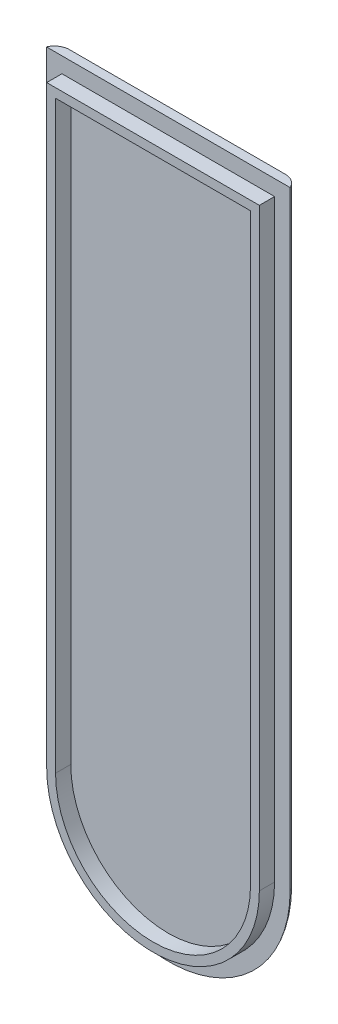
ISO-10303-21;
HEADER;
FILE_DESCRIPTION(('STEP AP214'),'2;1');
FILE_NAME('part.step','',(''),(''),'','','');
FILE_SCHEMA(('AUTOMOTIVE_DESIGN { 1 0 10303 214 1 1 1 1 }'));
ENDSEC;
DATA;
#1=APPLICATION_CONTEXT('core data for automotive mechanical design processes');
#2=APPLICATION_PROTOCOL_DEFINITION('international standard','automotive_design',2000,#1);
#3=PRODUCT_CONTEXT('',#1,'mechanical');
#4=PRODUCT('Part','Part','',(#3));
#5=PRODUCT_RELATED_PRODUCT_CATEGORY('part','',(#4));
#6=PRODUCT_DEFINITION_FORMATION('','',#4);
#7=PRODUCT_DEFINITION_CONTEXT('part definition',#1,'design');
#8=PRODUCT_DEFINITION('design','',#6,#7);
#9=PRODUCT_DEFINITION_SHAPE('','',#8);
#10=(LENGTH_UNIT() NAMED_UNIT(*) SI_UNIT(.MILLI.,.METRE.));
#11=(NAMED_UNIT(*) PLANE_ANGLE_UNIT() SI_UNIT($,.RADIAN.));
#12=(NAMED_UNIT(*) SI_UNIT($,.STERADIAN.) SOLID_ANGLE_UNIT());
#13=UNCERTAINTY_MEASURE_WITH_UNIT(LENGTH_MEASURE(1.E-05),#10,'distance_accuracy_value','');
#14=(GEOMETRIC_REPRESENTATION_CONTEXT(3) GLOBAL_UNCERTAINTY_ASSIGNED_CONTEXT((#13)) GLOBAL_UNIT_ASSIGNED_CONTEXT((#10,
#11,#12)) REPRESENTATION_CONTEXT('',''));
#15=CARTESIAN_POINT('',(0.,0.,0.));
#16=DIRECTION('',(0.,0.,1.));
#17=DIRECTION('',(1.,0.,0.));
#18=AXIS2_PLACEMENT_3D('',#15,#16,#17);
#19=CARTESIAN_POINT('',(0.,0.,3.));
#20=DIRECTION('',(0.,0.,1.));
#21=DIRECTION('',(1.,0.,0.));
#22=AXIS2_PLACEMENT_3D('',#19,#20,#21);
#23=PLANE('',#22);
#24=CARTESIAN_POINT('',(0.,0.,3.));
#25=DIRECTION('',(0.,0.,1.));
#26=DIRECTION('',(1.,0.,0.));
#27=AXIS2_PLACEMENT_3D('',#24,#25,#26);
#28=CIRCLE('',#27,40.);
#29=CARTESIAN_POINT('',(-40.,0.,3.));
#30=VERTEX_POINT('',#29);
#31=CARTESIAN_POINT('',(40.,0.,3.));
#32=VERTEX_POINT('',#31);
#33=EDGE_CURVE('E229',#30,#32,#28,.T.);
#34=ORIENTED_EDGE('',*,*,#33,.T.);
#35=DIRECTION('',(0.,1.,0.));
#36=VECTOR('',#35,1.);
#37=CARTESIAN_POINT('',(40.,200.,3.));
#38=LINE('',#37,#36);
#39=CARTESIAN_POINT('',(40.,200.,3.));
#40=VERTEX_POINT('',#39);
#41=EDGE_CURVE('E232',#32,#40,#38,.T.);
#42=ORIENTED_EDGE('',*,*,#41,.T.);
#43=DIRECTION('',(-1.,0.,0.));
#44=VECTOR('',#43,1.);
#45=CARTESIAN_POINT('',(-40.,200.,3.));
#46=LINE('',#45,#44);
#47=CARTESIAN_POINT('',(-40.,200.,3.));
#48=VERTEX_POINT('',#47);
#49=EDGE_CURVE('E236',#40,#48,#46,.T.);
#50=ORIENTED_EDGE('',*,*,#49,.T.);
#51=DIRECTION('',(0.,-1.,0.));
#52=VECTOR('',#51,1.);
#53=CARTESIAN_POINT('',(-40.,0.,3.));
#54=LINE('',#53,#52);
#55=EDGE_CURVE('E240',#48,#30,#54,.T.);
#56=ORIENTED_EDGE('',*,*,#55,.T.);
#57=EDGE_LOOP('',(#34,#42,#50,#56));
#58=FACE_BOUND('',#57,.T.);
#59=DIRECTION('',(0.,1.,0.));
#60=VECTOR('',#59,1.);
#61=CARTESIAN_POINT('',(34.9,194.9,3.));
#62=LINE('',#61,#60);
#63=CARTESIAN_POINT('',(34.9,0.,3.));
#64=VERTEX_POINT('',#63);
#65=CARTESIAN_POINT('',(34.9,194.9,3.));
#66=VERTEX_POINT('',#65);
#67=EDGE_CURVE('E206',#64,#66,#62,.T.);
#68=ORIENTED_EDGE('',*,*,#67,.F.);
#69=CARTESIAN_POINT('',(0.,0.,3.));
#70=DIRECTION('',(0.,0.,1.));
#71=DIRECTION('',(1.,0.,0.));
#72=AXIS2_PLACEMENT_3D('',#69,#70,#71);
#73=CIRCLE('',#72,34.9);
#74=CARTESIAN_POINT('',(-34.9,0.,3.));
#75=VERTEX_POINT('',#74);
#76=EDGE_CURVE('E155',#75,#64,#73,.T.);
#77=ORIENTED_EDGE('',*,*,#76,.F.);
#78=DIRECTION('',(0.,-1.,0.));
#79=VECTOR('',#78,1.);
#80=CARTESIAN_POINT('',(-34.9,0.,3.));
#81=LINE('',#80,#79);
#82=CARTESIAN_POINT('',(-34.9,194.9,3.));
#83=VERTEX_POINT('',#82);
#84=EDGE_CURVE('E193',#83,#75,#81,.T.);
#85=ORIENTED_EDGE('',*,*,#84,.F.);
#86=DIRECTION('',(-1.,0.,0.));
#87=VECTOR('',#86,1.);
#88=CARTESIAN_POINT('',(-34.9,194.9,3.));
#89=LINE('',#88,#87);
#90=EDGE_CURVE('E209',#66,#83,#89,.T.);
#91=ORIENTED_EDGE('',*,*,#90,.F.);
#92=EDGE_LOOP('',(#68,#77,#85,#91));
#93=FACE_BOUND('',#92,.T.);
#94=ADVANCED_FACE('F45',(#58,#93),#23,.T.);
#95=CARTESIAN_POINT('',(-40.,200.,3.));
#96=DIRECTION('',(0.,-1.,0.));
#97=DIRECTION('',(0.,0.,-1.));
#98=AXIS2_PLACEMENT_3D('',#95,#96,#97);
#99=PLANE('',#98);
#100=ORIENTED_EDGE('',*,*,#49,.F.);
#101=CARTESIAN_POINT('',(35.4174243050442,200.,5.));
#102=DIRECTION('',(0.,-1.,0.));
#103=DIRECTION('',(0.,0.,-1.));
#104=AXIS2_PLACEMENT_3D('',#101,#102,#103);
#105=CIRCLE('',#104,5.);
#106=CARTESIAN_POINT('',(35.4174243050441,200.,0.));
#107=VERTEX_POINT('',#106);
#108=EDGE_CURVE('E249',#40,#107,#105,.F.);
#109=ORIENTED_EDGE('',*,*,#108,.T.);
#110=DIRECTION('',(-1.,0.,0.));
#111=VECTOR('',#110,1.);
#112=CARTESIAN_POINT('',(-40.,200.,0.));
#113=LINE('',#112,#111);
#114=CARTESIAN_POINT('',(-35.4174243050442,200.,0.));
#115=VERTEX_POINT('',#114);
#116=EDGE_CURVE('E228',#107,#115,#113,.T.);
#117=ORIENTED_EDGE('',*,*,#116,.T.);
#118=CARTESIAN_POINT('',(-35.4174243050442,200.,5.));
#119=DIRECTION('',(0.,-1.,0.));
#120=DIRECTION('',(0.,0.,-1.));
#121=AXIS2_PLACEMENT_3D('',#118,#119,#120);
#122=CIRCLE('',#121,5.);
#123=EDGE_CURVE('E243',#115,#48,#122,.F.);
#124=ORIENTED_EDGE('',*,*,#123,.T.);
#125=EDGE_LOOP('',(#100,#109,#117,#124));
#126=FACE_BOUND('',#125,.T.);
#127=ADVANCED_FACE('F274',(#126),#99,.F.);
#128=CARTESIAN_POINT('',(0.,0.,0.));
#129=DIRECTION('',(0.,0.,1.));
#130=DIRECTION('',(1.,0.,0.));
#131=AXIS2_PLACEMENT_3D('',#128,#129,#130);
#132=PLANE('',#131);
#133=ORIENTED_EDGE('',*,*,#116,.F.);
#134=DIRECTION('',(0.,1.,0.));
#135=VECTOR('',#134,1.);
#136=CARTESIAN_POINT('',(35.4174243050442,0.,0.));
#137=LINE('',#136,#135);
#138=CARTESIAN_POINT('',(35.4174243050442,0.,0.));
#139=VERTEX_POINT('',#138);
#140=EDGE_CURVE('E11',#107,#139,#137,.F.);
#141=ORIENTED_EDGE('',*,*,#140,.T.);
#142=CARTESIAN_POINT('',(0.,0.,0.));
#143=DIRECTION('',(0.,0.,1.));
#144=DIRECTION('',(1.,0.,0.));
#145=AXIS2_PLACEMENT_3D('',#142,#143,#144);
#146=CIRCLE('',#145,35.4174243050442);
#147=CARTESIAN_POINT('',(-35.4174243050442,0.,0.));
#148=VERTEX_POINT('',#147);
#149=EDGE_CURVE('E55',#139,#148,#146,.F.);
#150=ORIENTED_EDGE('',*,*,#149,.T.);
#151=DIRECTION('',(0.,-1.,0.));
#152=VECTOR('',#151,1.);
#153=CARTESIAN_POINT('',(-35.4174243050442,0.,0.));
#154=LINE('',#153,#152);
#155=EDGE_CURVE('E252',#148,#115,#154,.F.);
#156=ORIENTED_EDGE('',*,*,#155,.T.);
#157=EDGE_LOOP('',(#133,#141,#150,#156));
#158=FACE_BOUND('',#157,.T.);
#159=ADVANCED_FACE('F271',(#158),#132,.F.);
#160=CARTESIAN_POINT('',(0.,0.,8.));
#161=DIRECTION('',(0.,0.,1.));
#162=DIRECTION('',(1.,0.,0.));
#163=AXIS2_PLACEMENT_3D('',#160,#161,#162);
#164=PLANE('',#163);
#165=CARTESIAN_POINT('',(0.,0.,8.));
#166=DIRECTION('',(0.,0.,1.));
#167=DIRECTION('',(1.,0.,0.));
#168=AXIS2_PLACEMENT_3D('',#165,#166,#167);
#169=CIRCLE('',#168,34.9);
#170=CARTESIAN_POINT('',(-34.9,0.,8.));
#171=VERTEX_POINT('',#170);
#172=CARTESIAN_POINT('',(34.9,0.,8.));
#173=VERTEX_POINT('',#172);
#174=EDGE_CURVE('E188',#171,#173,#169,.T.);
#175=ORIENTED_EDGE('',*,*,#174,.T.);
#176=DIRECTION('',(0.,1.,0.));
#177=VECTOR('',#176,1.);
#178=CARTESIAN_POINT('',(34.9,194.9,8.));
#179=LINE('',#178,#177);
#180=CARTESIAN_POINT('',(34.9,194.9,8.));
#181=VERTEX_POINT('',#180);
#182=EDGE_CURVE('E192',#173,#181,#179,.T.);
#183=ORIENTED_EDGE('',*,*,#182,.T.);
#184=DIRECTION('',(-1.,0.,0.));
#185=VECTOR('',#184,1.);
#186=CARTESIAN_POINT('',(-34.9,194.9,8.));
#187=LINE('',#186,#185);
#188=CARTESIAN_POINT('',(-34.9,194.9,8.));
#189=VERTEX_POINT('',#188);
#190=EDGE_CURVE('E196',#181,#189,#187,.T.);
#191=ORIENTED_EDGE('',*,*,#190,.T.);
#192=DIRECTION('',(0.,-1.,0.));
#193=VECTOR('',#192,1.);
#194=CARTESIAN_POINT('',(-34.9,0.,8.));
#195=LINE('',#194,#193);
#196=EDGE_CURVE('E199',#189,#171,#195,.T.);
#197=ORIENTED_EDGE('',*,*,#196,.T.);
#198=EDGE_LOOP('',(#175,#183,#191,#197));
#199=FACE_BOUND('',#198,.T.);
#200=DIRECTION('',(0.,1.,0.));
#201=VECTOR('',#200,1.);
#202=CARTESIAN_POINT('',(32.,0.,8.));
#203=LINE('',#202,#201);
#204=CARTESIAN_POINT('',(32.,0.,8.));
#205=VERTEX_POINT('',#204);
#206=CARTESIAN_POINT('',(32.,191.9,8.));
#207=VERTEX_POINT('',#206);
#208=EDGE_CURVE('E145',#205,#207,#203,.T.);
#209=ORIENTED_EDGE('',*,*,#208,.F.);
#210=CARTESIAN_POINT('',(0.,0.,8.));
#211=DIRECTION('',(0.,0.,1.));
#212=DIRECTION('',(1.,0.,0.));
#213=AXIS2_PLACEMENT_3D('',#210,#211,#212);
#214=CIRCLE('',#213,32.);
#215=CARTESIAN_POINT('',(-32.,0.,8.));
#216=VERTEX_POINT('',#215);
#217=EDGE_CURVE('E134',#216,#205,#214,.T.);
#218=ORIENTED_EDGE('',*,*,#217,.F.);
#219=DIRECTION('',(0.,-1.,0.));
#220=VECTOR('',#219,1.);
#221=CARTESIAN_POINT('',(-32.,191.9,8.));
#222=LINE('',#221,#220);
#223=CARTESIAN_POINT('',(-32.,191.9,8.));
#224=VERTEX_POINT('',#223);
#225=EDGE_CURVE('E165',#224,#216,#222,.T.);
#226=ORIENTED_EDGE('',*,*,#225,.F.);
#227=DIRECTION('',(-1.,0.,0.));
#228=VECTOR('',#227,1.);
#229=CARTESIAN_POINT('',(32.,191.9,8.));
#230=LINE('',#229,#228);
#231=EDGE_CURVE('E161',#207,#224,#230,.T.);
#232=ORIENTED_EDGE('',*,*,#231,.F.);
#233=EDGE_LOOP('',(#209,#218,#226,#232));
#234=FACE_BOUND('',#233,.T.);
#235=ADVANCED_FACE('F159',(#199,#234),#164,.T.);
#236=CARTESIAN_POINT('',(0.,0.,8.));
#237=DIRECTION('',(0.,0.,-1.));
#238=DIRECTION('',(-1.,0.,0.));
#239=AXIS2_PLACEMENT_3D('',#236,#237,#238);
#240=CYLINDRICAL_SURFACE('',#239,34.9);
#241=ORIENTED_EDGE('',*,*,#76,.T.);
#242=DIRECTION('',(0.,0.,-1.));
#243=VECTOR('',#242,1.);
#244=CARTESIAN_POINT('',(34.9,0.,8.));
#245=LINE('',#244,#243);
#246=EDGE_CURVE('E225',#173,#64,#245,.T.);
#247=ORIENTED_EDGE('',*,*,#246,.F.);
#248=ORIENTED_EDGE('',*,*,#174,.F.);
#249=DIRECTION('',(0.,0.,-1.));
#250=VECTOR('',#249,1.);
#251=CARTESIAN_POINT('',(-34.9,0.,8.));
#252=LINE('',#251,#250);
#253=EDGE_CURVE('E202',#171,#75,#252,.T.);
#254=ORIENTED_EDGE('',*,*,#253,.T.);
#255=EDGE_LOOP('',(#241,#247,#248,#254));
#256=FACE_BOUND('',#255,.T.);
#257=ADVANCED_FACE('F298',(#256),#240,.T.);
#258=CARTESIAN_POINT('',(34.9,194.9,8.));
#259=DIRECTION('',(-1.,0.,0.));
#260=DIRECTION('',(0.,0.,1.));
#261=AXIS2_PLACEMENT_3D('',#258,#259,#260);
#262=PLANE('',#261);
#263=ORIENTED_EDGE('',*,*,#67,.T.);
#264=DIRECTION('',(0.,0.,-1.));
#265=VECTOR('',#264,1.);
#266=CARTESIAN_POINT('',(34.9,194.9,8.));
#267=LINE('',#266,#265);
#268=EDGE_CURVE('E221',#181,#66,#267,.T.);
#269=ORIENTED_EDGE('',*,*,#268,.F.);
#270=ORIENTED_EDGE('',*,*,#182,.F.);
#271=ORIENTED_EDGE('',*,*,#246,.T.);
#272=EDGE_LOOP('',(#263,#269,#270,#271));
#273=FACE_BOUND('',#272,.T.);
#274=ADVANCED_FACE('F287',(#273),#262,.F.);
#275=CARTESIAN_POINT('',(-34.9,194.9,8.));
#276=DIRECTION('',(0.,-1.,0.));
#277=DIRECTION('',(0.,0.,-1.));
#278=AXIS2_PLACEMENT_3D('',#275,#276,#277);
#279=PLANE('',#278);
#280=ORIENTED_EDGE('',*,*,#90,.T.);
#281=DIRECTION('',(0.,0.,-1.));
#282=VECTOR('',#281,1.);
#283=CARTESIAN_POINT('',(-34.9,194.9,8.));
#284=LINE('',#283,#282);
#285=EDGE_CURVE('E218',#189,#83,#284,.T.);
#286=ORIENTED_EDGE('',*,*,#285,.F.);
#287=ORIENTED_EDGE('',*,*,#190,.F.);
#288=ORIENTED_EDGE('',*,*,#268,.T.);
#289=EDGE_LOOP('',(#280,#286,#287,#288));
#290=FACE_BOUND('',#289,.T.);
#291=ADVANCED_FACE('F291',(#290),#279,.F.);
#292=CARTESIAN_POINT('',(-34.9,0.,8.));
#293=DIRECTION('',(1.,0.,0.));
#294=DIRECTION('',(0.,0.,-1.));
#295=AXIS2_PLACEMENT_3D('',#292,#293,#294);
#296=PLANE('',#295);
#297=ORIENTED_EDGE('',*,*,#84,.T.);
#298=ORIENTED_EDGE('',*,*,#253,.F.);
#299=ORIENTED_EDGE('',*,*,#196,.F.);
#300=ORIENTED_EDGE('',*,*,#285,.T.);
#301=EDGE_LOOP('',(#297,#298,#299,#300));
#302=FACE_BOUND('',#301,.T.);
#303=ADVANCED_FACE('F300',(#302),#296,.F.);
#304=CARTESIAN_POINT('',(0.,0.,8.));
#305=DIRECTION('',(0.,0.,-1.));
#306=DIRECTION('',(-1.,0.,0.));
#307=AXIS2_PLACEMENT_3D('',#304,#305,#306);
#308=CYLINDRICAL_SURFACE('',#307,32.);
#309=CARTESIAN_POINT('',(0.,0.,3.));
#310=DIRECTION('',(0.,0.,1.));
#311=DIRECTION('',(1.,0.,0.));
#312=AXIS2_PLACEMENT_3D('',#309,#310,#311);
#313=CIRCLE('',#312,32.);
#314=CARTESIAN_POINT('',(-32.,0.,3.));
#315=VERTEX_POINT('',#314);
#316=CARTESIAN_POINT('',(32.,0.,3.));
#317=VERTEX_POINT('',#316);
#318=EDGE_CURVE('E170',#315,#317,#313,.T.);
#319=ORIENTED_EDGE('',*,*,#318,.F.);
#320=DIRECTION('',(0.,0.,-1.));
#321=VECTOR('',#320,1.);
#322=CARTESIAN_POINT('',(-32.,0.,8.));
#323=LINE('',#322,#321);
#324=EDGE_CURVE('E140',#216,#315,#323,.T.);
#325=ORIENTED_EDGE('',*,*,#324,.F.);
#326=ORIENTED_EDGE('',*,*,#217,.T.);
#327=DIRECTION('',(0.,0.,-1.));
#328=VECTOR('',#327,1.);
#329=CARTESIAN_POINT('',(32.,0.,8.));
#330=LINE('',#329,#328);
#331=EDGE_CURVE('E138',#205,#317,#330,.T.);
#332=ORIENTED_EDGE('',*,*,#331,.T.);
#333=EDGE_LOOP('',(#319,#325,#326,#332));
#334=FACE_BOUND('',#333,.T.);
#335=ADVANCED_FACE('F137',(#334),#308,.F.);
#336=CARTESIAN_POINT('',(32.,0.,8.));
#337=DIRECTION('',(-1.,0.,0.));
#338=DIRECTION('',(0.,-1.,0.));
#339=AXIS2_PLACEMENT_3D('',#336,#337,#338);
#340=PLANE('',#339);
#341=DIRECTION('',(0.,1.,0.));
#342=VECTOR('',#341,1.);
#343=CARTESIAN_POINT('',(32.,0.,3.));
#344=LINE('',#343,#342);
#345=CARTESIAN_POINT('',(32.,191.9,3.));
#346=VERTEX_POINT('',#345);
#347=EDGE_CURVE('E153',#317,#346,#344,.T.);
#348=ORIENTED_EDGE('',*,*,#347,.F.);
#349=ORIENTED_EDGE('',*,*,#331,.F.);
#350=ORIENTED_EDGE('',*,*,#208,.T.);
#351=DIRECTION('',(0.,0.,-1.));
#352=VECTOR('',#351,1.);
#353=CARTESIAN_POINT('',(32.,191.9,8.));
#354=LINE('',#353,#352);
#355=EDGE_CURVE('E156',#207,#346,#354,.T.);
#356=ORIENTED_EDGE('',*,*,#355,.T.);
#357=EDGE_LOOP('',(#348,#349,#350,#356));
#358=FACE_BOUND('',#357,.T.);
#359=ADVANCED_FACE('F150',(#358),#340,.T.);
#360=CARTESIAN_POINT('',(32.,191.9,8.));
#361=DIRECTION('',(0.,-1.,0.));
#362=DIRECTION('',(0.,0.,-1.));
#363=AXIS2_PLACEMENT_3D('',#360,#361,#362);
#364=PLANE('',#363);
#365=DIRECTION('',(-1.,0.,0.));
#366=VECTOR('',#365,1.);
#367=CARTESIAN_POINT('',(32.,191.9,3.));
#368=LINE('',#367,#366);
#369=CARTESIAN_POINT('',(-32.,191.9,3.));
#370=VERTEX_POINT('',#369);
#371=EDGE_CURVE('E175',#346,#370,#368,.T.);
#372=ORIENTED_EDGE('',*,*,#371,.F.);
#373=ORIENTED_EDGE('',*,*,#355,.F.);
#374=ORIENTED_EDGE('',*,*,#231,.T.);
#375=DIRECTION('',(0.,0.,-1.));
#376=VECTOR('',#375,1.);
#377=CARTESIAN_POINT('',(-32.,191.9,8.));
#378=LINE('',#377,#376);
#379=EDGE_CURVE('E182',#224,#370,#378,.T.);
#380=ORIENTED_EDGE('',*,*,#379,.T.);
#381=EDGE_LOOP('',(#372,#373,#374,#380));
#382=FACE_BOUND('',#381,.T.);
#383=ADVANCED_FACE('F353',(#382),#364,.T.);
#384=CARTESIAN_POINT('',(-32.,191.9,8.));
#385=DIRECTION('',(1.,0.,0.));
#386=DIRECTION('',(0.,1.,0.));
#387=AXIS2_PLACEMENT_3D('',#384,#385,#386);
#388=PLANE('',#387);
#389=DIRECTION('',(0.,-1.,0.));
#390=VECTOR('',#389,1.);
#391=CARTESIAN_POINT('',(-32.,191.9,3.));
#392=LINE('',#391,#390);
#393=EDGE_CURVE('E146',#370,#315,#392,.T.);
#394=ORIENTED_EDGE('',*,*,#393,.F.);
#395=ORIENTED_EDGE('',*,*,#379,.F.);
#396=ORIENTED_EDGE('',*,*,#225,.T.);
#397=ORIENTED_EDGE('',*,*,#324,.T.);
#398=EDGE_LOOP('',(#394,#395,#396,#397));
#399=FACE_BOUND('',#398,.T.);
#400=ADVANCED_FACE('F316',(#399),#388,.T.);
#401=ORIENTED_EDGE('',*,*,#318,.T.);
#402=ORIENTED_EDGE('',*,*,#347,.T.);
#403=ORIENTED_EDGE('',*,*,#371,.T.);
#404=ORIENTED_EDGE('',*,*,#393,.T.);
#405=EDGE_LOOP('',(#401,#402,#403,#404));
#406=FACE_BOUND('',#405,.T.);
#407=ADVANCED_FACE('F280',(#406),#23,.T.);
#408=CARTESIAN_POINT('',(-35.4174243050442,0.,5.));
#409=DIRECTION('',(0.,-1.,0.));
#410=DIRECTION('',(1.,0.,0.));
#411=AXIS2_PLACEMENT_3D('',#408,#409,#410);
#412=CYLINDRICAL_SURFACE('',#411,5.);
#413=ORIENTED_EDGE('',*,*,#123,.F.);
#414=ORIENTED_EDGE('',*,*,#155,.F.);
#415=CARTESIAN_POINT('',(-35.4174243050442,0.,5.));
#416=DIRECTION('',(0.,-1.,0.));
#417=DIRECTION('',(1.,0.,0.));
#418=AXIS2_PLACEMENT_3D('',#415,#416,#417);
#419=CIRCLE('',#418,5.);
#420=EDGE_CURVE('E49',#30,#148,#419,.T.);
#421=ORIENTED_EDGE('',*,*,#420,.F.);
#422=ORIENTED_EDGE('',*,*,#55,.F.);
#423=EDGE_LOOP('',(#413,#414,#421,#422));
#424=FACE_BOUND('',#423,.T.);
#425=ADVANCED_FACE('F47',(#424),#412,.T.);
#426=CARTESIAN_POINT('',(0.,0.,5.));
#427=DIRECTION('',(0.,0.,-1.));
#428=DIRECTION('',(-1.,0.,0.));
#429=AXIS2_PLACEMENT_3D('',#426,#427,#428);
#430=TOROIDAL_SURFACE('',#429,35.4174243050442,5.);
#431=ORIENTED_EDGE('',*,*,#420,.T.);
#432=ORIENTED_EDGE('',*,*,#149,.F.);
#433=CARTESIAN_POINT('',(35.4174243050442,0.,5.));
#434=DIRECTION('',(0.,1.,0.));
#435=DIRECTION('',(0.,0.,1.));
#436=AXIS2_PLACEMENT_3D('',#433,#434,#435);
#437=CIRCLE('',#436,5.);
#438=EDGE_CURVE('E256',#32,#139,#437,.T.);
#439=ORIENTED_EDGE('',*,*,#438,.F.);
#440=ORIENTED_EDGE('',*,*,#33,.F.);
#441=EDGE_LOOP('',(#431,#432,#439,#440));
#442=FACE_BOUND('',#441,.T.);
#443=ADVANCED_FACE('F267',(#442),#430,.T.);
#444=CARTESIAN_POINT('',(35.4174243050442,200.,5.));
#445=DIRECTION('',(0.,1.,0.));
#446=DIRECTION('',(-1.,0.,0.));
#447=AXIS2_PLACEMENT_3D('',#444,#445,#446);
#448=CYLINDRICAL_SURFACE('',#447,5.);
#449=ORIENTED_EDGE('',*,*,#438,.T.);
#450=ORIENTED_EDGE('',*,*,#140,.F.);
#451=ORIENTED_EDGE('',*,*,#108,.F.);
#452=ORIENTED_EDGE('',*,*,#41,.F.);
#453=EDGE_LOOP('',(#449,#450,#451,#452));
#454=FACE_BOUND('',#453,.T.);
#455=ADVANCED_FACE('F275',(#454),#448,.T.);
#456=CLOSED_SHELL('',(#94,#127,#159,#235,#257,#274,#291,#303,#335,#359,#383,#400,#407,#425,#443,#455));
#457=MANIFOLD_SOLID_BREP('B2',#456);
#458=ADVANCED_BREP_SHAPE_REPRESENTATION('',(#18,#457),#14);
#459=SHAPE_DEFINITION_REPRESENTATION(#9,#458);
ENDSEC;
END-ISO-10303-21;
